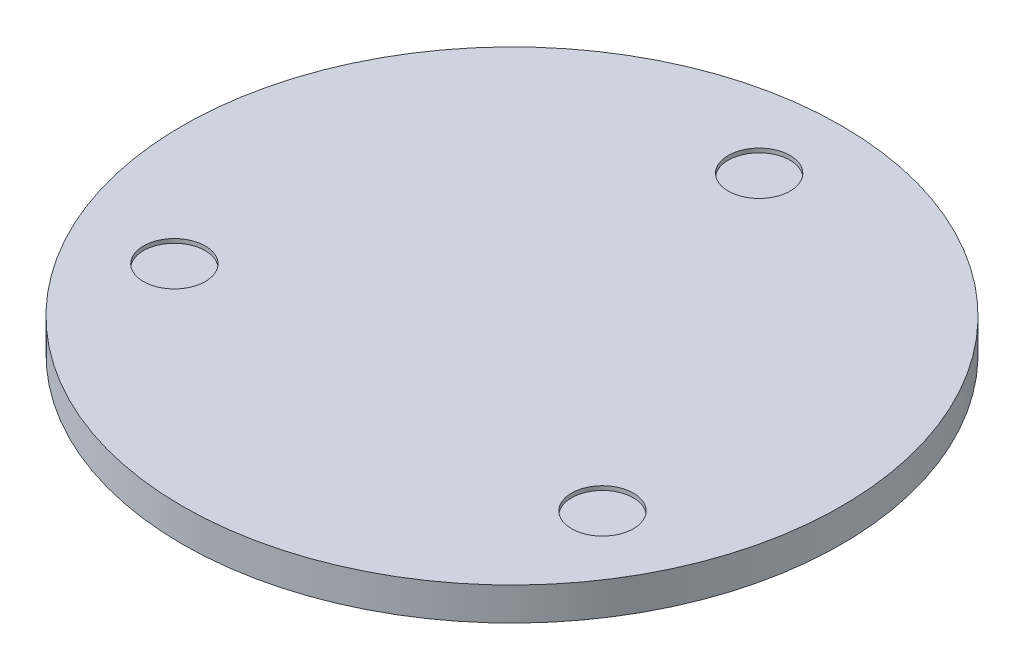
ISO-10303-21;
HEADER;
FILE_DESCRIPTION(('STEP AP214'),'2;1');
FILE_NAME('part.step','',(''),(''),'','','');
FILE_SCHEMA(('AUTOMOTIVE_DESIGN { 1 0 10303 214 1 1 1 1 }'));
ENDSEC;
DATA;
#1=APPLICATION_CONTEXT('core data for automotive mechanical design processes');
#2=APPLICATION_PROTOCOL_DEFINITION('international standard','automotive_design',2000,#1);
#3=PRODUCT_CONTEXT('',#1,'mechanical');
#4=PRODUCT('Part','Part','',(#3));
#5=PRODUCT_RELATED_PRODUCT_CATEGORY('part','',(#4));
#6=PRODUCT_DEFINITION_FORMATION('','',#4);
#7=PRODUCT_DEFINITION_CONTEXT('part definition',#1,'design');
#8=PRODUCT_DEFINITION('design','',#6,#7);
#9=PRODUCT_DEFINITION_SHAPE('','',#8);
#10=(LENGTH_UNIT() NAMED_UNIT(*) SI_UNIT(.MILLI.,.METRE.));
#11=(NAMED_UNIT(*) PLANE_ANGLE_UNIT() SI_UNIT($,.RADIAN.));
#12=(NAMED_UNIT(*) SI_UNIT($,.STERADIAN.) SOLID_ANGLE_UNIT());
#13=UNCERTAINTY_MEASURE_WITH_UNIT(LENGTH_MEASURE(1.E-05),#10,'distance_accuracy_value','');
#14=(GEOMETRIC_REPRESENTATION_CONTEXT(3) GLOBAL_UNCERTAINTY_ASSIGNED_CONTEXT((#13)) GLOBAL_UNIT_ASSIGNED_CONTEXT((#10,
#11,#12)) REPRESENTATION_CONTEXT('',''));
#15=CARTESIAN_POINT('',(0.,0.,0.));
#16=DIRECTION('',(0.,0.,1.));
#17=DIRECTION('',(1.,0.,0.));
#18=AXIS2_PLACEMENT_3D('',#15,#16,#17);
#19=CARTESIAN_POINT('',(0.,-2.54000000000001,0.));
#20=DIRECTION('',(0.,-1.,0.));
#21=DIRECTION('',(0.,0.,-1.));
#22=AXIS2_PLACEMENT_3D('',#19,#20,#21);
#23=PLANE('',#22);
#24=CARTESIAN_POINT('',(0.,-2.54000000000001,0.));
#25=DIRECTION('',(0.,1.,0.));
#26=DIRECTION('',(0.,0.,1.));
#27=AXIS2_PLACEMENT_3D('',#24,#25,#26);
#28=CIRCLE('',#27,38.1);
#29=CARTESIAN_POINT('',(0.,-2.54000000000001,38.1));
#30=VERTEX_POINT('',#29);
#31=EDGE_CURVE('E46',#30,#30,#28,.T.);
#32=ORIENTED_EDGE('',*,*,#31,.F.);
#33=EDGE_LOOP('',(#32));
#34=FACE_BOUND('',#33,.T.);
#35=ADVANCED_FACE('F32',(#34),#23,.T.);
#36=CARTESIAN_POINT('',(0.,0.,0.));
#37=DIRECTION('',(0.,1.,0.));
#38=DIRECTION('',(0.,0.,1.));
#39=AXIS2_PLACEMENT_3D('',#36,#37,#38);
#40=PLANE('',#39);
#41=CARTESIAN_POINT('',(0.,0.,-38.1));
#42=DIRECTION('',(0.,1.,0.));
#43=DIRECTION('',(0.,0.,1.));
#44=AXIS2_PLACEMENT_3D('',#41,#42,#43);
#45=CIRCLE('',#44,4.7625);
#46=CARTESIAN_POINT('',(0.,0.,-33.3375));
#47=VERTEX_POINT('',#46);
#48=EDGE_CURVE('E64',#47,#47,#45,.T.);
#49=ORIENTED_EDGE('',*,*,#48,.F.);
#50=EDGE_LOOP('',(#49));
#51=FACE_BOUND('',#50,.T.);
#52=CARTESIAN_POINT('',(-32.995567884187,0.,19.0500000000002));
#53=DIRECTION('',(0.,1.,0.));
#54=DIRECTION('',(0.,0.,1.));
#55=AXIS2_PLACEMENT_3D('',#52,#53,#54);
#56=CIRCLE('',#55,4.7625);
#57=CARTESIAN_POINT('',(-32.995567884187,0.,23.8125000000002));
#58=VERTEX_POINT('',#57);
#59=EDGE_CURVE('E58',#58,#58,#56,.T.);
#60=ORIENTED_EDGE('',*,*,#59,.F.);
#61=EDGE_LOOP('',(#60));
#62=FACE_BOUND('',#61,.T.);
#63=CARTESIAN_POINT('',(32.995567884187,0.,19.0500000000001));
#64=DIRECTION('',(0.,1.,0.));
#65=DIRECTION('',(0.,0.,1.));
#66=AXIS2_PLACEMENT_3D('',#63,#64,#65);
#67=CIRCLE('',#66,4.7625);
#68=CARTESIAN_POINT('',(32.995567884187,0.,23.8125000000001));
#69=VERTEX_POINT('',#68);
#70=EDGE_CURVE('E52',#69,#69,#67,.T.);
#71=ORIENTED_EDGE('',*,*,#70,.F.);
#72=EDGE_LOOP('',(#71));
#73=FACE_BOUND('',#72,.T.);
#74=CARTESIAN_POINT('',(0.,0.,0.));
#75=DIRECTION('',(0.,1.,0.));
#76=DIRECTION('',(0.,0.,1.));
#77=AXIS2_PLACEMENT_3D('',#74,#75,#76);
#78=CIRCLE('',#77,50.8);
#79=CARTESIAN_POINT('',(0.,0.,50.8));
#80=VERTEX_POINT('',#79);
#81=EDGE_CURVE('E10',#80,#80,#78,.T.);
#82=ORIENTED_EDGE('',*,*,#81,.T.);
#83=EDGE_LOOP('',(#82));
#84=FACE_BOUND('',#83,.T.);
#85=ADVANCED_FACE('F79',(#51,#62,#73,#84),#40,.T.);
#86=CARTESIAN_POINT('',(0.,4.56768535142939,0.));
#87=DIRECTION('',(0.,1.,0.));
#88=DIRECTION('',(0.,0.,1.));
#89=AXIS2_PLACEMENT_3D('',#86,#87,#88);
#90=CYLINDRICAL_SURFACE('',#89,50.8);
#91=CARTESIAN_POINT('',(0.,-5.08000000000001,0.));
#92=DIRECTION('',(0.,1.,0.));
#93=DIRECTION('',(0.,0.,1.));
#94=AXIS2_PLACEMENT_3D('',#91,#92,#93);
#95=CIRCLE('',#94,50.8);
#96=CARTESIAN_POINT('',(0.,-5.08000000000001,50.8));
#97=VERTEX_POINT('',#96);
#98=EDGE_CURVE('E38',#97,#97,#95,.T.);
#99=ORIENTED_EDGE('',*,*,#98,.T.);
#100=EDGE_LOOP('',(#99));
#101=FACE_BOUND('',#100,.T.);
#102=ORIENTED_EDGE('',*,*,#81,.F.);
#103=EDGE_LOOP('',(#102));
#104=FACE_BOUND('',#103,.T.);
#105=ADVANCED_FACE('F82',(#101,#104),#90,.T.);
#106=CARTESIAN_POINT('',(0.,-5.08000000000001,0.));
#107=DIRECTION('',(0.,-1.,0.));
#108=DIRECTION('',(0.,0.,-1.));
#109=AXIS2_PLACEMENT_3D('',#106,#107,#108);
#110=PLANE('',#109);
#111=CARTESIAN_POINT('',(0.,-5.08000000000001,0.));
#112=DIRECTION('',(0.,1.,0.));
#113=DIRECTION('',(0.,0.,1.));
#114=AXIS2_PLACEMENT_3D('',#111,#112,#113);
#115=CIRCLE('',#114,38.1);
#116=CARTESIAN_POINT('',(0.,-5.08000000000001,38.1));
#117=VERTEX_POINT('',#116);
#118=EDGE_CURVE('E42',#117,#117,#115,.T.);
#119=ORIENTED_EDGE('',*,*,#118,.T.);
#120=EDGE_LOOP('',(#119));
#121=FACE_BOUND('',#120,.T.);
#122=ORIENTED_EDGE('',*,*,#98,.F.);
#123=EDGE_LOOP('',(#122));
#124=FACE_BOUND('',#123,.T.);
#125=ADVANCED_FACE('F100',(#121,#124),#110,.T.);
#126=CARTESIAN_POINT('',(0.,4.56768535142939,0.));
#127=DIRECTION('',(0.,1.,0.));
#128=DIRECTION('',(0.,0.,1.));
#129=AXIS2_PLACEMENT_3D('',#126,#127,#128);
#130=CYLINDRICAL_SURFACE('',#129,38.1);
#131=ORIENTED_EDGE('',*,*,#31,.T.);
#132=EDGE_LOOP('',(#131));
#133=FACE_BOUND('',#132,.T.);
#134=ORIENTED_EDGE('',*,*,#118,.F.);
#135=EDGE_LOOP('',(#134));
#136=FACE_BOUND('',#135,.T.);
#137=ADVANCED_FACE('F90',(#133,#136),#130,.F.);
#138=CARTESIAN_POINT('',(32.995567884187,-0.635,19.0500000000001));
#139=DIRECTION('',(0.,1.,0.));
#140=DIRECTION('',(0.,0.,1.));
#141=AXIS2_PLACEMENT_3D('',#138,#139,#140);
#142=CYLINDRICAL_SURFACE('',#141,4.7625);
#143=CARTESIAN_POINT('',(32.995567884187,-0.635,19.0500000000001));
#144=DIRECTION('',(0.,1.,0.));
#145=DIRECTION('',(0.,0.,1.));
#146=AXIS2_PLACEMENT_3D('',#143,#144,#145);
#147=CIRCLE('',#146,4.7625);
#148=CARTESIAN_POINT('',(32.995567884187,-0.635,23.8125000000001));
#149=VERTEX_POINT('',#148);
#150=EDGE_CURVE('E51',#149,#149,#147,.T.);
#151=ORIENTED_EDGE('',*,*,#150,.F.);
#152=EDGE_LOOP('',(#151));
#153=FACE_BOUND('',#152,.T.);
#154=ORIENTED_EDGE('',*,*,#70,.T.);
#155=EDGE_LOOP('',(#154));
#156=FACE_BOUND('',#155,.T.);
#157=ADVANCED_FACE('F87',(#153,#156),#142,.F.);
#158=CARTESIAN_POINT('',(0.,-0.635,0.));
#159=DIRECTION('',(0.,1.,0.));
#160=DIRECTION('',(0.,0.,1.));
#161=AXIS2_PLACEMENT_3D('',#158,#159,#160);
#162=PLANE('',#161);
#163=ORIENTED_EDGE('',*,*,#150,.T.);
#164=EDGE_LOOP('',(#163));
#165=FACE_BOUND('',#164,.T.);
#166=ADVANCED_FACE('F89',(#165),#162,.T.);
#167=CARTESIAN_POINT('',(-32.995567884187,-0.635,19.0500000000002));
#168=DIRECTION('',(0.,1.,0.));
#169=DIRECTION('',(0.,0.,1.));
#170=AXIS2_PLACEMENT_3D('',#167,#168,#169);
#171=CYLINDRICAL_SURFACE('',#170,4.7625);
#172=CARTESIAN_POINT('',(-32.995567884187,-0.635,19.0500000000002));
#173=DIRECTION('',(0.,1.,0.));
#174=DIRECTION('',(0.,0.,1.));
#175=AXIS2_PLACEMENT_3D('',#172,#173,#174);
#176=CIRCLE('',#175,4.7625);
#177=CARTESIAN_POINT('',(-32.995567884187,-0.635,23.8125000000002));
#178=VERTEX_POINT('',#177);
#179=EDGE_CURVE('E55',#178,#178,#176,.T.);
#180=ORIENTED_EDGE('',*,*,#179,.F.);
#181=EDGE_LOOP('',(#180));
#182=FACE_BOUND('',#181,.T.);
#183=ORIENTED_EDGE('',*,*,#59,.T.);
#184=EDGE_LOOP('',(#183));
#185=FACE_BOUND('',#184,.T.);
#186=ADVANCED_FACE('F97',(#182,#185),#171,.F.);
#187=CARTESIAN_POINT('',(0.,-0.635,0.));
#188=DIRECTION('',(0.,1.,0.));
#189=DIRECTION('',(0.,0.,1.));
#190=AXIS2_PLACEMENT_3D('',#187,#188,#189);
#191=PLANE('',#190);
#192=ORIENTED_EDGE('',*,*,#179,.T.);
#193=EDGE_LOOP('',(#192));
#194=FACE_BOUND('',#193,.T.);
#195=ADVANCED_FACE('F75',(#194),#191,.T.);
#196=CARTESIAN_POINT('',(0.,-0.635,-38.1));
#197=DIRECTION('',(0.,1.,0.));
#198=DIRECTION('',(0.,0.,1.));
#199=AXIS2_PLACEMENT_3D('',#196,#197,#198);
#200=CYLINDRICAL_SURFACE('',#199,4.7625);
#201=CARTESIAN_POINT('',(0.,-0.635,-38.1));
#202=DIRECTION('',(0.,1.,0.));
#203=DIRECTION('',(0.,0.,1.));
#204=AXIS2_PLACEMENT_3D('',#201,#202,#203);
#205=CIRCLE('',#204,4.7625);
#206=CARTESIAN_POINT('',(0.,-0.635,-33.3375));
#207=VERTEX_POINT('',#206);
#208=EDGE_CURVE('E61',#207,#207,#205,.T.);
#209=ORIENTED_EDGE('',*,*,#208,.F.);
#210=EDGE_LOOP('',(#209));
#211=FACE_BOUND('',#210,.T.);
#212=ORIENTED_EDGE('',*,*,#48,.T.);
#213=EDGE_LOOP('',(#212));
#214=FACE_BOUND('',#213,.T.);
#215=ADVANCED_FACE('F72',(#211,#214),#200,.F.);
#216=CARTESIAN_POINT('',(0.,-0.635,0.));
#217=DIRECTION('',(0.,1.,0.));
#218=DIRECTION('',(0.,0.,1.));
#219=AXIS2_PLACEMENT_3D('',#216,#217,#218);
#220=PLANE('',#219);
#221=ORIENTED_EDGE('',*,*,#208,.T.);
#222=EDGE_LOOP('',(#221));
#223=FACE_BOUND('',#222,.T.);
#224=ADVANCED_FACE('F70',(#223),#220,.T.);
#225=CLOSED_SHELL('',(#35,#85,#105,#125,#137,#157,#166,#186,#195,#215,#224));
#226=MANIFOLD_SOLID_BREP('B2',#225);
#227=ADVANCED_BREP_SHAPE_REPRESENTATION('',(#18,#226),#14);
#228=SHAPE_DEFINITION_REPRESENTATION(#9,#227);
ENDSEC;
END-ISO-10303-21;
